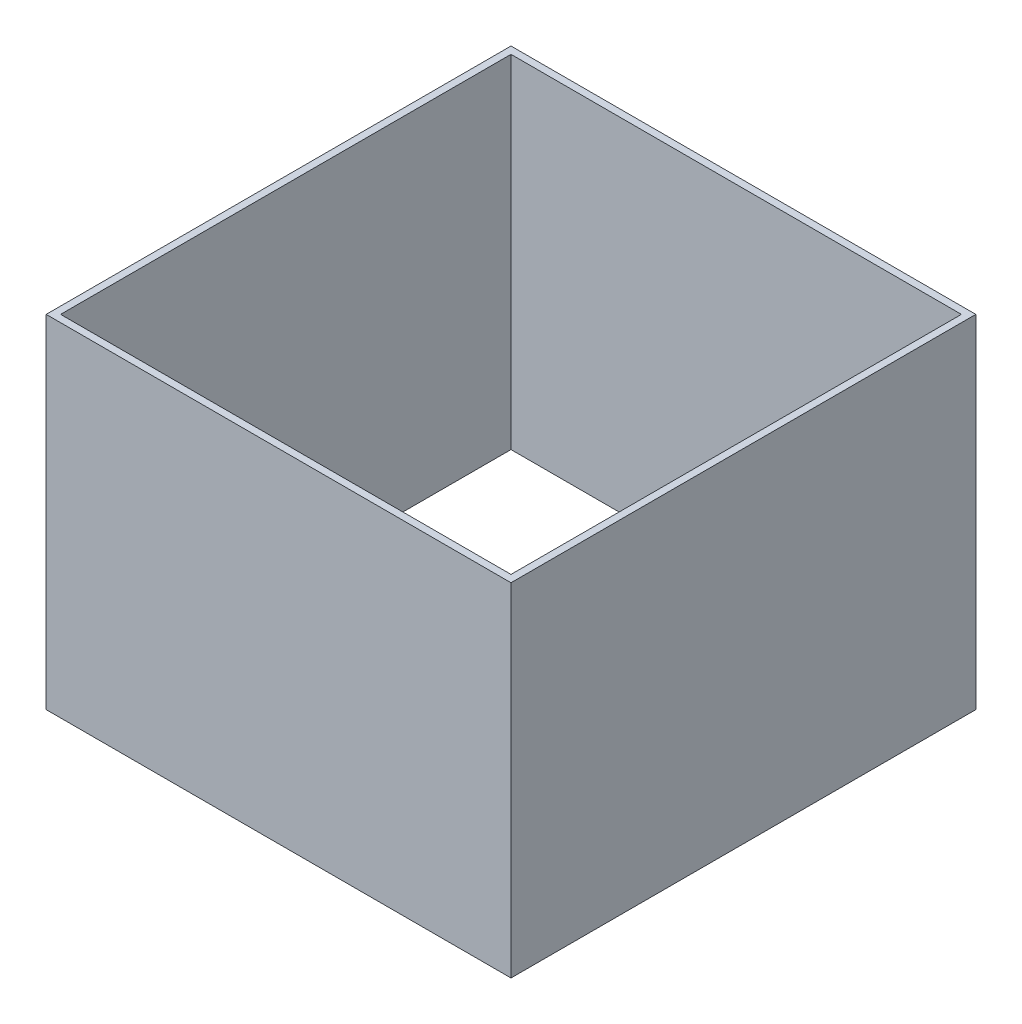
ISO-10303-21;
HEADER;
FILE_DESCRIPTION(('STEP AP214'),'2;1');
FILE_NAME('part.step','',(''),(''),'','','');
FILE_SCHEMA(('AUTOMOTIVE_DESIGN { 1 0 10303 214 1 1 1 1 }'));
ENDSEC;
DATA;
#1=APPLICATION_CONTEXT('core data for automotive mechanical design processes');
#2=APPLICATION_PROTOCOL_DEFINITION('international standard','automotive_design',2000,#1);
#3=PRODUCT_CONTEXT('',#1,'mechanical');
#4=PRODUCT('Part','Part','',(#3));
#5=PRODUCT_RELATED_PRODUCT_CATEGORY('part','',(#4));
#6=PRODUCT_DEFINITION_FORMATION('','',#4);
#7=PRODUCT_DEFINITION_CONTEXT('part definition',#1,'design');
#8=PRODUCT_DEFINITION('design','',#6,#7);
#9=PRODUCT_DEFINITION_SHAPE('','',#8);
#10=(LENGTH_UNIT() NAMED_UNIT(*) SI_UNIT(.MILLI.,.METRE.));
#11=(NAMED_UNIT(*) PLANE_ANGLE_UNIT() SI_UNIT($,.RADIAN.));
#12=(NAMED_UNIT(*) SI_UNIT($,.STERADIAN.) SOLID_ANGLE_UNIT());
#13=UNCERTAINTY_MEASURE_WITH_UNIT(LENGTH_MEASURE(1.E-05),#10,'distance_accuracy_value','');
#14=(GEOMETRIC_REPRESENTATION_CONTEXT(3) GLOBAL_UNCERTAINTY_ASSIGNED_CONTEXT((#13)) GLOBAL_UNIT_ASSIGNED_CONTEXT((#10,
#11,#12)) REPRESENTATION_CONTEXT('',''));
#15=CARTESIAN_POINT('',(0.,0.,0.));
#16=DIRECTION('',(0.,0.,1.));
#17=DIRECTION('',(1.,0.,0.));
#18=AXIS2_PLACEMENT_3D('',#15,#16,#17);
#19=CARTESIAN_POINT('',(0.,190.,0.));
#20=DIRECTION('',(0.,1.,0.));
#21=DIRECTION('',(0.,0.,1.));
#22=AXIS2_PLACEMENT_3D('',#19,#20,#21);
#23=PLANE('',#22);
#24=DIRECTION('',(0.,0.,-1.));
#25=VECTOR('',#24,1.);
#26=CARTESIAN_POINT('',(129.,190.,-129.));
#27=LINE('',#26,#25);
#28=CARTESIAN_POINT('',(129.,190.,129.));
#29=VERTEX_POINT('',#28);
#30=CARTESIAN_POINT('',(129.,190.,-129.));
#31=VERTEX_POINT('',#30);
#32=EDGE_CURVE('E134',#29,#31,#27,.T.);
#33=ORIENTED_EDGE('',*,*,#32,.T.);
#34=DIRECTION('',(-1.,0.,0.));
#35=VECTOR('',#34,1.);
#36=CARTESIAN_POINT('',(-129.,190.,-129.));
#37=LINE('',#36,#35);
#38=CARTESIAN_POINT('',(-129.,190.,-129.));
#39=VERTEX_POINT('',#38);
#40=EDGE_CURVE('E137',#31,#39,#37,.T.);
#41=ORIENTED_EDGE('',*,*,#40,.T.);
#42=DIRECTION('',(0.,0.,1.));
#43=VECTOR('',#42,1.);
#44=CARTESIAN_POINT('',(-129.,190.,-129.));
#45=LINE('',#44,#43);
#46=CARTESIAN_POINT('',(-129.,190.,129.));
#47=VERTEX_POINT('',#46);
#48=EDGE_CURVE('E140',#39,#47,#45,.T.);
#49=ORIENTED_EDGE('',*,*,#48,.T.);
#50=DIRECTION('',(1.,0.,0.));
#51=VECTOR('',#50,1.);
#52=CARTESIAN_POINT('',(-129.,190.,129.));
#53=LINE('',#52,#51);
#54=EDGE_CURVE('E142',#47,#29,#53,.T.);
#55=ORIENTED_EDGE('',*,*,#54,.T.);
#56=EDGE_LOOP('',(#33,#41,#49,#55));
#57=FACE_BOUND('',#56,.T.);
#58=DIRECTION('',(-1.,0.,0.));
#59=VECTOR('',#58,1.);
#60=CARTESIAN_POINT('',(-125.,190.,-125.));
#61=LINE('',#60,#59);
#62=CARTESIAN_POINT('',(125.,190.,-125.));
#63=VERTEX_POINT('',#62);
#64=CARTESIAN_POINT('',(-125.,190.,-125.));
#65=VERTEX_POINT('',#64);
#66=EDGE_CURVE('E106',#63,#65,#61,.T.);
#67=ORIENTED_EDGE('',*,*,#66,.F.);
#68=DIRECTION('',(0.,0.,-1.));
#69=VECTOR('',#68,1.);
#70=CARTESIAN_POINT('',(125.,190.,-125.));
#71=LINE('',#70,#69);
#72=CARTESIAN_POINT('',(125.,190.,125.));
#73=VERTEX_POINT('',#72);
#74=EDGE_CURVE('E98',#73,#63,#71,.T.);
#75=ORIENTED_EDGE('',*,*,#74,.F.);
#76=DIRECTION('',(1.,0.,0.));
#77=VECTOR('',#76,1.);
#78=CARTESIAN_POINT('',(-125.,190.,125.));
#79=LINE('',#78,#77);
#80=CARTESIAN_POINT('',(-125.,190.,125.));
#81=VERTEX_POINT('',#80);
#82=EDGE_CURVE('E120',#81,#73,#79,.T.);
#83=ORIENTED_EDGE('',*,*,#82,.F.);
#84=DIRECTION('',(0.,0.,1.));
#85=VECTOR('',#84,1.);
#86=CARTESIAN_POINT('',(-125.,190.,-125.));
#87=LINE('',#86,#85);
#88=EDGE_CURVE('E118',#65,#81,#87,.T.);
#89=ORIENTED_EDGE('',*,*,#88,.F.);
#90=EDGE_LOOP('',(#67,#75,#83,#89));
#91=FACE_BOUND('',#90,.T.);
#92=ADVANCED_FACE('F33',(#57,#91),#23,.T.);
#93=CARTESIAN_POINT('',(0.,0.,0.));
#94=DIRECTION('',(0.,1.,0.));
#95=DIRECTION('',(0.,0.,1.));
#96=AXIS2_PLACEMENT_3D('',#93,#94,#95);
#97=PLANE('',#96);
#98=DIRECTION('',(0.,0.,-1.));
#99=VECTOR('',#98,1.);
#100=CARTESIAN_POINT('',(129.,0.,-129.));
#101=LINE('',#100,#99);
#102=CARTESIAN_POINT('',(129.,0.,129.));
#103=VERTEX_POINT('',#102);
#104=CARTESIAN_POINT('',(129.,0.,-129.));
#105=VERTEX_POINT('',#104);
#106=EDGE_CURVE('E114',#103,#105,#101,.T.);
#107=ORIENTED_EDGE('',*,*,#106,.F.);
#108=DIRECTION('',(1.,0.,0.));
#109=VECTOR('',#108,1.);
#110=CARTESIAN_POINT('',(-129.,0.,129.));
#111=LINE('',#110,#109);
#112=CARTESIAN_POINT('',(-129.,0.,129.));
#113=VERTEX_POINT('',#112);
#114=EDGE_CURVE('E138',#113,#103,#111,.T.);
#115=ORIENTED_EDGE('',*,*,#114,.F.);
#116=DIRECTION('',(0.,0.,1.));
#117=VECTOR('',#116,1.);
#118=CARTESIAN_POINT('',(-129.,0.,-129.));
#119=LINE('',#118,#117);
#120=CARTESIAN_POINT('',(-129.,0.,-129.));
#121=VERTEX_POINT('',#120);
#122=EDGE_CURVE('E149',#121,#113,#119,.T.);
#123=ORIENTED_EDGE('',*,*,#122,.F.);
#124=DIRECTION('',(-1.,0.,0.));
#125=VECTOR('',#124,1.);
#126=CARTESIAN_POINT('',(-129.,0.,-129.));
#127=LINE('',#126,#125);
#128=EDGE_CURVE('E147',#105,#121,#127,.T.);
#129=ORIENTED_EDGE('',*,*,#128,.F.);
#130=EDGE_LOOP('',(#107,#115,#123,#129));
#131=FACE_BOUND('',#130,.T.);
#132=DIRECTION('',(0.,0.,-1.));
#133=VECTOR('',#132,1.);
#134=CARTESIAN_POINT('',(125.,0.,-125.));
#135=LINE('',#134,#133);
#136=CARTESIAN_POINT('',(125.,0.,125.));
#137=VERTEX_POINT('',#136);
#138=CARTESIAN_POINT('',(125.,0.,-125.));
#139=VERTEX_POINT('',#138);
#140=EDGE_CURVE('E56',#137,#139,#135,.T.);
#141=ORIENTED_EDGE('',*,*,#140,.T.);
#142=DIRECTION('',(-1.,0.,0.));
#143=VECTOR('',#142,1.);
#144=CARTESIAN_POINT('',(-125.,0.,-125.));
#145=LINE('',#144,#143);
#146=CARTESIAN_POINT('',(-125.,0.,-125.));
#147=VERTEX_POINT('',#146);
#148=EDGE_CURVE('E113',#139,#147,#145,.T.);
#149=ORIENTED_EDGE('',*,*,#148,.T.);
#150=DIRECTION('',(0.,0.,1.));
#151=VECTOR('',#150,1.);
#152=CARTESIAN_POINT('',(-125.,0.,-125.));
#153=LINE('',#152,#151);
#154=CARTESIAN_POINT('',(-125.,0.,125.));
#155=VERTEX_POINT('',#154);
#156=EDGE_CURVE('E126',#147,#155,#153,.T.);
#157=ORIENTED_EDGE('',*,*,#156,.T.);
#158=DIRECTION('',(1.,0.,0.));
#159=VECTOR('',#158,1.);
#160=CARTESIAN_POINT('',(-125.,0.,125.));
#161=LINE('',#160,#159);
#162=EDGE_CURVE('E107',#155,#137,#161,.T.);
#163=ORIENTED_EDGE('',*,*,#162,.T.);
#164=EDGE_LOOP('',(#141,#149,#157,#163));
#165=FACE_BOUND('',#164,.T.);
#166=ADVANCED_FACE('F167',(#131,#165),#97,.F.);
#167=CARTESIAN_POINT('',(129.,190.,-129.));
#168=DIRECTION('',(-1.,0.,0.));
#169=DIRECTION('',(0.,0.,1.));
#170=AXIS2_PLACEMENT_3D('',#167,#168,#169);
#171=PLANE('',#170);
#172=ORIENTED_EDGE('',*,*,#106,.T.);
#173=DIRECTION('',(0.,-1.,0.));
#174=VECTOR('',#173,1.);
#175=CARTESIAN_POINT('',(129.,190.,-129.));
#176=LINE('',#175,#174);
#177=EDGE_CURVE('E11',#31,#105,#176,.T.);
#178=ORIENTED_EDGE('',*,*,#177,.F.);
#179=ORIENTED_EDGE('',*,*,#32,.F.);
#180=DIRECTION('',(0.,-1.,0.));
#181=VECTOR('',#180,1.);
#182=CARTESIAN_POINT('',(129.,190.,129.));
#183=LINE('',#182,#181);
#184=EDGE_CURVE('E144',#29,#103,#183,.T.);
#185=ORIENTED_EDGE('',*,*,#184,.T.);
#186=EDGE_LOOP('',(#172,#178,#179,#185));
#187=FACE_BOUND('',#186,.T.);
#188=ADVANCED_FACE('F35',(#187),#171,.F.);
#189=CARTESIAN_POINT('',(-129.,190.,-129.));
#190=DIRECTION('',(0.,0.,1.));
#191=DIRECTION('',(1.,0.,0.));
#192=AXIS2_PLACEMENT_3D('',#189,#190,#191);
#193=PLANE('',#192);
#194=ORIENTED_EDGE('',*,*,#128,.T.);
#195=DIRECTION('',(0.,-1.,0.));
#196=VECTOR('',#195,1.);
#197=CARTESIAN_POINT('',(-129.,190.,-129.));
#198=LINE('',#197,#196);
#199=EDGE_CURVE('E41',#39,#121,#198,.T.);
#200=ORIENTED_EDGE('',*,*,#199,.F.);
#201=ORIENTED_EDGE('',*,*,#40,.F.);
#202=ORIENTED_EDGE('',*,*,#177,.T.);
#203=EDGE_LOOP('',(#194,#200,#201,#202));
#204=FACE_BOUND('',#203,.T.);
#205=ADVANCED_FACE('F177',(#204),#193,.F.);
#206=CARTESIAN_POINT('',(-129.,190.,-129.));
#207=DIRECTION('',(1.,0.,0.));
#208=DIRECTION('',(0.,0.,-1.));
#209=AXIS2_PLACEMENT_3D('',#206,#207,#208);
#210=PLANE('',#209);
#211=ORIENTED_EDGE('',*,*,#122,.T.);
#212=DIRECTION('',(0.,-1.,0.));
#213=VECTOR('',#212,1.);
#214=CARTESIAN_POINT('',(-129.,190.,129.));
#215=LINE('',#214,#213);
#216=EDGE_CURVE('E154',#47,#113,#215,.T.);
#217=ORIENTED_EDGE('',*,*,#216,.F.);
#218=ORIENTED_EDGE('',*,*,#48,.F.);
#219=ORIENTED_EDGE('',*,*,#199,.T.);
#220=EDGE_LOOP('',(#211,#217,#218,#219));
#221=FACE_BOUND('',#220,.T.);
#222=ADVANCED_FACE('F161',(#221),#210,.F.);
#223=CARTESIAN_POINT('',(-129.,190.,129.));
#224=DIRECTION('',(0.,0.,-1.));
#225=DIRECTION('',(-1.,0.,0.));
#226=AXIS2_PLACEMENT_3D('',#223,#224,#225);
#227=PLANE('',#226);
#228=ORIENTED_EDGE('',*,*,#114,.T.);
#229=ORIENTED_EDGE('',*,*,#184,.F.);
#230=ORIENTED_EDGE('',*,*,#54,.F.);
#231=ORIENTED_EDGE('',*,*,#216,.T.);
#232=EDGE_LOOP('',(#228,#229,#230,#231));
#233=FACE_BOUND('',#232,.T.);
#234=ADVANCED_FACE('F171',(#233),#227,.F.);
#235=CARTESIAN_POINT('',(125.,190.,-125.));
#236=DIRECTION('',(-1.,0.,0.));
#237=DIRECTION('',(0.,0.,1.));
#238=AXIS2_PLACEMENT_3D('',#235,#236,#237);
#239=PLANE('',#238);
#240=ORIENTED_EDGE('',*,*,#140,.F.);
#241=DIRECTION('',(0.,-1.,0.));
#242=VECTOR('',#241,1.);
#243=CARTESIAN_POINT('',(125.,190.,125.));
#244=LINE('',#243,#242);
#245=EDGE_CURVE('E102',#73,#137,#244,.T.);
#246=ORIENTED_EDGE('',*,*,#245,.F.);
#247=ORIENTED_EDGE('',*,*,#74,.T.);
#248=DIRECTION('',(0.,-1.,0.));
#249=VECTOR('',#248,1.);
#250=CARTESIAN_POINT('',(125.,190.,-125.));
#251=LINE('',#250,#249);
#252=EDGE_CURVE('E101',#63,#139,#251,.T.);
#253=ORIENTED_EDGE('',*,*,#252,.T.);
#254=EDGE_LOOP('',(#240,#246,#247,#253));
#255=FACE_BOUND('',#254,.T.);
#256=ADVANCED_FACE('F100',(#255),#239,.T.);
#257=CARTESIAN_POINT('',(-125.,190.,-125.));
#258=DIRECTION('',(0.,0.,1.));
#259=DIRECTION('',(1.,0.,0.));
#260=AXIS2_PLACEMENT_3D('',#257,#258,#259);
#261=PLANE('',#260);
#262=ORIENTED_EDGE('',*,*,#148,.F.);
#263=ORIENTED_EDGE('',*,*,#252,.F.);
#264=ORIENTED_EDGE('',*,*,#66,.T.);
#265=DIRECTION('',(0.,-1.,0.));
#266=VECTOR('',#265,1.);
#267=CARTESIAN_POINT('',(-125.,190.,-125.));
#268=LINE('',#267,#266);
#269=EDGE_CURVE('E115',#65,#147,#268,.T.);
#270=ORIENTED_EDGE('',*,*,#269,.T.);
#271=EDGE_LOOP('',(#262,#263,#264,#270));
#272=FACE_BOUND('',#271,.T.);
#273=ADVANCED_FACE('F110',(#272),#261,.T.);
#274=CARTESIAN_POINT('',(-125.,190.,-125.));
#275=DIRECTION('',(1.,0.,0.));
#276=DIRECTION('',(0.,0.,-1.));
#277=AXIS2_PLACEMENT_3D('',#274,#275,#276);
#278=PLANE('',#277);
#279=ORIENTED_EDGE('',*,*,#156,.F.);
#280=ORIENTED_EDGE('',*,*,#269,.F.);
#281=ORIENTED_EDGE('',*,*,#88,.T.);
#282=DIRECTION('',(0.,-1.,0.));
#283=VECTOR('',#282,1.);
#284=CARTESIAN_POINT('',(-125.,190.,125.));
#285=LINE('',#284,#283);
#286=EDGE_CURVE('E48',#81,#155,#285,.T.);
#287=ORIENTED_EDGE('',*,*,#286,.T.);
#288=EDGE_LOOP('',(#279,#280,#281,#287));
#289=FACE_BOUND('',#288,.T.);
#290=ADVANCED_FACE('F200',(#289),#278,.T.);
#291=CARTESIAN_POINT('',(-125.,190.,125.));
#292=DIRECTION('',(0.,0.,-1.));
#293=DIRECTION('',(-1.,0.,0.));
#294=AXIS2_PLACEMENT_3D('',#291,#292,#293);
#295=PLANE('',#294);
#296=ORIENTED_EDGE('',*,*,#162,.F.);
#297=ORIENTED_EDGE('',*,*,#286,.F.);
#298=ORIENTED_EDGE('',*,*,#82,.T.);
#299=ORIENTED_EDGE('',*,*,#245,.T.);
#300=EDGE_LOOP('',(#296,#297,#298,#299));
#301=FACE_BOUND('',#300,.T.);
#302=ADVANCED_FACE('F204',(#301),#295,.T.);
#303=CLOSED_SHELL('',(#92,#166,#188,#205,#222,#234,#256,#273,#290,#302));
#304=MANIFOLD_SOLID_BREP('B2',#303);
#305=ADVANCED_BREP_SHAPE_REPRESENTATION('',(#18,#304),#14);
#306=SHAPE_DEFINITION_REPRESENTATION(#9,#305);
ENDSEC;
END-ISO-10303-21;
